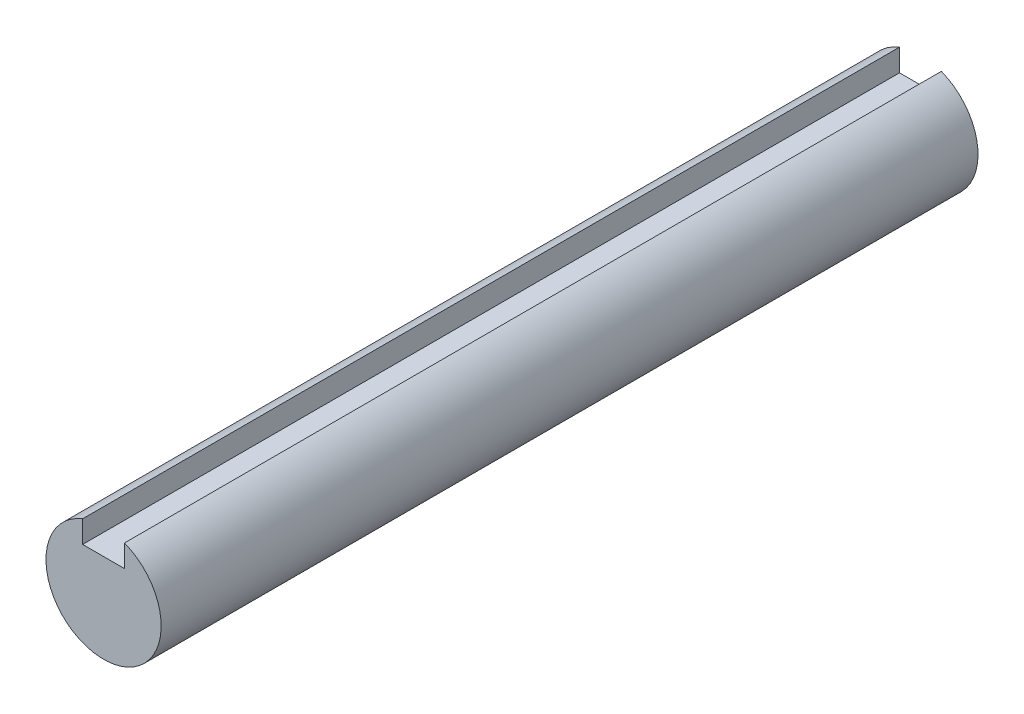
ISO-10303-21;
HEADER;
FILE_DESCRIPTION(('STEP AP214'),'2;1');
FILE_NAME('part.step','',(''),(''),'','','');
FILE_SCHEMA(('AUTOMOTIVE_DESIGN { 1 0 10303 214 1 1 1 1 }'));
ENDSEC;
DATA;
#1=APPLICATION_CONTEXT('core data for automotive mechanical design processes');
#2=APPLICATION_PROTOCOL_DEFINITION('international standard','automotive_design',2000,#1);
#3=PRODUCT_CONTEXT('',#1,'mechanical');
#4=PRODUCT('Part','Part','',(#3));
#5=PRODUCT_RELATED_PRODUCT_CATEGORY('part','',(#4));
#6=PRODUCT_DEFINITION_FORMATION('','',#4);
#7=PRODUCT_DEFINITION_CONTEXT('part definition',#1,'design');
#8=PRODUCT_DEFINITION('design','',#6,#7);
#9=PRODUCT_DEFINITION_SHAPE('','',#8);
#10=(LENGTH_UNIT() NAMED_UNIT(*) SI_UNIT(.MILLI.,.METRE.));
#11=(NAMED_UNIT(*) PLANE_ANGLE_UNIT() SI_UNIT($,.RADIAN.));
#12=(NAMED_UNIT(*) SI_UNIT($,.STERADIAN.) SOLID_ANGLE_UNIT());
#13=UNCERTAINTY_MEASURE_WITH_UNIT(LENGTH_MEASURE(1.E-05),#10,'distance_accuracy_value','');
#14=(GEOMETRIC_REPRESENTATION_CONTEXT(3) GLOBAL_UNCERTAINTY_ASSIGNED_CONTEXT((#13)) GLOBAL_UNIT_ASSIGNED_CONTEXT((#10,
#11,#12)) REPRESENTATION_CONTEXT('',''));
#15=CARTESIAN_POINT('',(0.,0.,0.));
#16=DIRECTION('',(0.,0.,1.));
#17=DIRECTION('',(1.,0.,0.));
#18=AXIS2_PLACEMENT_3D('',#15,#16,#17);
#19=CARTESIAN_POINT('',(-2.,0.,78.));
#20=DIRECTION('',(1.,0.,0.));
#21=DIRECTION('',(0.,0.,-1.));
#22=AXIS2_PLACEMENT_3D('',#19,#20,#21);
#23=PLANE('',#22);
#24=DIRECTION('',(0.,-1.,0.));
#25=VECTOR('',#24,1.);
#26=CARTESIAN_POINT('',(-2.,0.,0.));
#27=LINE('',#26,#25);
#28=CARTESIAN_POINT('',(-2.,5.1234753829798,0.));
#29=VERTEX_POINT('',#28);
#30=CARTESIAN_POINT('',(-2.,3.,0.));
#31=VERTEX_POINT('',#30);
#32=EDGE_CURVE('E97',#29,#31,#27,.T.);
#33=ORIENTED_EDGE('',*,*,#32,.F.);
#34=DIRECTION('',(0.,0.,-1.));
#35=VECTOR('',#34,1.);
#36=CARTESIAN_POINT('',(-2.,5.1234753829798,78.));
#37=LINE('',#36,#35);
#38=CARTESIAN_POINT('',(-2.,5.1234753829798,78.));
#39=VERTEX_POINT('',#38);
#40=EDGE_CURVE('E11',#39,#29,#37,.T.);
#41=ORIENTED_EDGE('',*,*,#40,.F.);
#42=DIRECTION('',(0.,-1.,0.));
#43=VECTOR('',#42,1.);
#44=CARTESIAN_POINT('',(-2.,0.,78.));
#45=LINE('',#44,#43);
#46=CARTESIAN_POINT('',(-2.,3.,78.));
#47=VERTEX_POINT('',#46);
#48=EDGE_CURVE('E82',#39,#47,#45,.T.);
#49=ORIENTED_EDGE('',*,*,#48,.T.);
#50=DIRECTION('',(0.,0.,-1.));
#51=VECTOR('',#50,1.);
#52=CARTESIAN_POINT('',(-2.,3.,78.));
#53=LINE('',#52,#51);
#54=EDGE_CURVE('E50',#47,#31,#53,.T.);
#55=ORIENTED_EDGE('',*,*,#54,.T.);
#56=EDGE_LOOP('',(#33,#41,#49,#55));
#57=FACE_BOUND('',#56,.T.);
#58=ADVANCED_FACE('F34',(#57),#23,.T.);
#59=CARTESIAN_POINT('',(0.,0.,78.));
#60=DIRECTION('',(0.,0.,-1.));
#61=DIRECTION('',(-1.,0.,0.));
#62=AXIS2_PLACEMENT_3D('',#59,#60,#61);
#63=CYLINDRICAL_SURFACE('',#62,5.5);
#64=CARTESIAN_POINT('',(0.,0.,0.));
#65=DIRECTION('',(0.,0.,1.));
#66=DIRECTION('',(1.,0.,0.));
#67=AXIS2_PLACEMENT_3D('',#64,#65,#66);
#68=CIRCLE('',#67,5.5);
#69=CARTESIAN_POINT('',(2.,5.1234753829798,0.));
#70=VERTEX_POINT('',#69);
#71=EDGE_CURVE('E88',#29,#70,#68,.T.);
#72=ORIENTED_EDGE('',*,*,#71,.T.);
#73=DIRECTION('',(0.,0.,-1.));
#74=VECTOR('',#73,1.);
#75=CARTESIAN_POINT('',(2.,5.1234753829798,78.));
#76=LINE('',#75,#74);
#77=CARTESIAN_POINT('',(2.,5.1234753829798,78.));
#78=VERTEX_POINT('',#77);
#79=EDGE_CURVE('E42',#78,#70,#76,.T.);
#80=ORIENTED_EDGE('',*,*,#79,.F.);
#81=CARTESIAN_POINT('',(0.,0.,78.));
#82=DIRECTION('',(0.,0.,1.));
#83=DIRECTION('',(1.,0.,0.));
#84=AXIS2_PLACEMENT_3D('',#81,#82,#83);
#85=CIRCLE('',#84,5.5);
#86=EDGE_CURVE('E76',#39,#78,#85,.T.);
#87=ORIENTED_EDGE('',*,*,#86,.F.);
#88=ORIENTED_EDGE('',*,*,#40,.T.);
#89=EDGE_LOOP('',(#72,#80,#87,#88));
#90=FACE_BOUND('',#89,.T.);
#91=ADVANCED_FACE('F86',(#90),#63,.T.);
#92=CARTESIAN_POINT('',(2.,0.,78.));
#93=DIRECTION('',(1.,0.,0.));
#94=DIRECTION('',(0.,0.,-1.));
#95=AXIS2_PLACEMENT_3D('',#92,#93,#94);
#96=PLANE('',#95);
#97=DIRECTION('',(0.,-1.,0.));
#98=VECTOR('',#97,1.);
#99=CARTESIAN_POINT('',(2.,0.,0.));
#100=LINE('',#99,#98);
#101=CARTESIAN_POINT('',(2.,3.,0.));
#102=VERTEX_POINT('',#101);
#103=EDGE_CURVE('E100',#70,#102,#100,.T.);
#104=ORIENTED_EDGE('',*,*,#103,.T.);
#105=DIRECTION('',(0.,0.,-1.));
#106=VECTOR('',#105,1.);
#107=CARTESIAN_POINT('',(2.,3.,78.));
#108=LINE('',#107,#106);
#109=CARTESIAN_POINT('',(2.,3.,78.));
#110=VERTEX_POINT('',#109);
#111=EDGE_CURVE('E64',#110,#102,#108,.T.);
#112=ORIENTED_EDGE('',*,*,#111,.F.);
#113=DIRECTION('',(0.,-1.,0.));
#114=VECTOR('',#113,1.);
#115=CARTESIAN_POINT('',(2.,0.,78.));
#116=LINE('',#115,#114);
#117=EDGE_CURVE('E81',#78,#110,#116,.T.);
#118=ORIENTED_EDGE('',*,*,#117,.F.);
#119=ORIENTED_EDGE('',*,*,#79,.T.);
#120=EDGE_LOOP('',(#104,#112,#118,#119));
#121=FACE_BOUND('',#120,.T.);
#122=ADVANCED_FACE('F91',(#121),#96,.F.);
#123=CARTESIAN_POINT('',(0.,3.,78.));
#124=DIRECTION('',(0.,1.,0.));
#125=DIRECTION('',(0.,0.,1.));
#126=AXIS2_PLACEMENT_3D('',#123,#124,#125);
#127=PLANE('',#126);
#128=DIRECTION('',(1.,0.,0.));
#129=VECTOR('',#128,1.);
#130=CARTESIAN_POINT('',(0.,3.,0.));
#131=LINE('',#130,#129);
#132=EDGE_CURVE('E102',#31,#102,#131,.T.);
#133=ORIENTED_EDGE('',*,*,#132,.F.);
#134=ORIENTED_EDGE('',*,*,#54,.F.);
#135=DIRECTION('',(1.,0.,0.));
#136=VECTOR('',#135,1.);
#137=CARTESIAN_POINT('',(0.,3.,78.));
#138=LINE('',#137,#136);
#139=EDGE_CURVE('E92',#47,#110,#138,.T.);
#140=ORIENTED_EDGE('',*,*,#139,.T.);
#141=ORIENTED_EDGE('',*,*,#111,.T.);
#142=EDGE_LOOP('',(#133,#134,#140,#141));
#143=FACE_BOUND('',#142,.T.);
#144=ADVANCED_FACE('F107',(#143),#127,.T.);
#145=CARTESIAN_POINT('',(0.,0.,78.));
#146=DIRECTION('',(0.,0.,1.));
#147=DIRECTION('',(1.,0.,0.));
#148=AXIS2_PLACEMENT_3D('',#145,#146,#147);
#149=PLANE('',#148);
#150=ORIENTED_EDGE('',*,*,#48,.F.);
#151=ORIENTED_EDGE('',*,*,#86,.T.);
#152=ORIENTED_EDGE('',*,*,#117,.T.);
#153=ORIENTED_EDGE('',*,*,#139,.F.);
#154=EDGE_LOOP('',(#150,#151,#152,#153));
#155=FACE_BOUND('',#154,.T.);
#156=ADVANCED_FACE('F78',(#155),#149,.T.);
#157=CARTESIAN_POINT('',(0.,0.,0.));
#158=DIRECTION('',(0.,0.,1.));
#159=DIRECTION('',(1.,0.,0.));
#160=AXIS2_PLACEMENT_3D('',#157,#158,#159);
#161=PLANE('',#160);
#162=ORIENTED_EDGE('',*,*,#32,.T.);
#163=ORIENTED_EDGE('',*,*,#132,.T.);
#164=ORIENTED_EDGE('',*,*,#103,.F.);
#165=ORIENTED_EDGE('',*,*,#71,.F.);
#166=EDGE_LOOP('',(#162,#163,#164,#165));
#167=FACE_BOUND('',#166,.T.);
#168=ADVANCED_FACE('F114',(#167),#161,.F.);
#169=CLOSED_SHELL('',(#58,#91,#122,#144,#156,#168));
#170=MANIFOLD_SOLID_BREP('B2',#169);
#171=ADVANCED_BREP_SHAPE_REPRESENTATION('',(#18,#170),#14);
#172=SHAPE_DEFINITION_REPRESENTATION(#9,#171);
ENDSEC;
END-ISO-10303-21;
